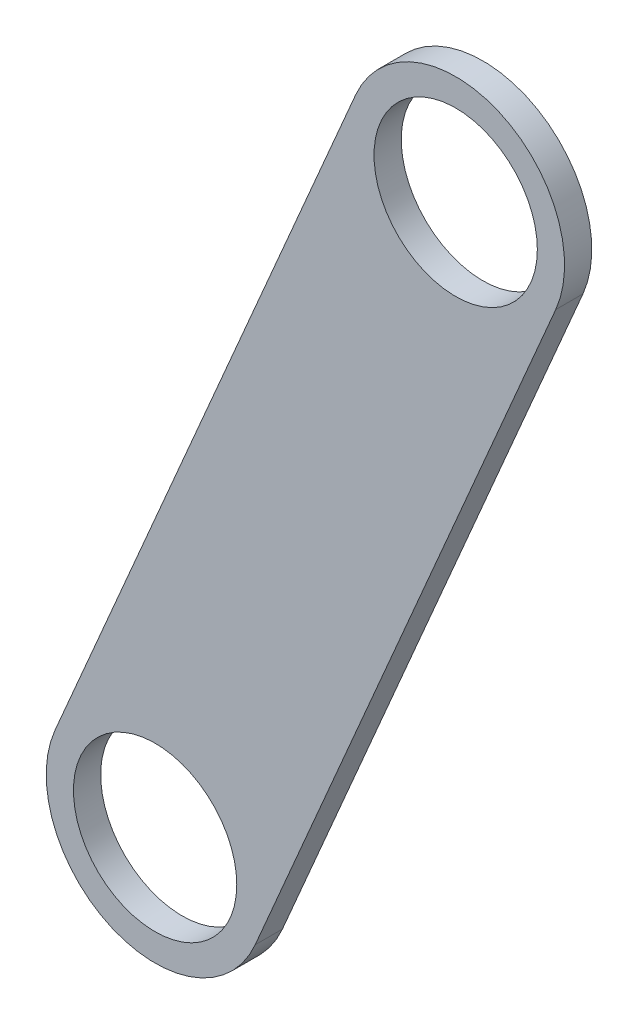
ISO-10303-21;
HEADER;
FILE_DESCRIPTION(('STEP AP214'),'2;1');
FILE_NAME('part.step','',(''),(''),'','','');
FILE_SCHEMA(('AUTOMOTIVE_DESIGN { 1 0 10303 214 1 1 1 1 }'));
ENDSEC;
DATA;
#1=APPLICATION_CONTEXT('core data for automotive mechanical design processes');
#2=APPLICATION_PROTOCOL_DEFINITION('international standard','automotive_design',2000,#1);
#3=PRODUCT_CONTEXT('',#1,'mechanical');
#4=PRODUCT('Part','Part','',(#3));
#5=PRODUCT_RELATED_PRODUCT_CATEGORY('part','',(#4));
#6=PRODUCT_DEFINITION_FORMATION('','',#4);
#7=PRODUCT_DEFINITION_CONTEXT('part definition',#1,'design');
#8=PRODUCT_DEFINITION('design','',#6,#7);
#9=PRODUCT_DEFINITION_SHAPE('','',#8);
#10=(LENGTH_UNIT() NAMED_UNIT(*) SI_UNIT(.MILLI.,.METRE.));
#11=(NAMED_UNIT(*) PLANE_ANGLE_UNIT() SI_UNIT($,.RADIAN.));
#12=(NAMED_UNIT(*) SI_UNIT($,.STERADIAN.) SOLID_ANGLE_UNIT());
#13=UNCERTAINTY_MEASURE_WITH_UNIT(LENGTH_MEASURE(1.E-05),#10,'distance_accuracy_value','');
#14=(GEOMETRIC_REPRESENTATION_CONTEXT(3) GLOBAL_UNCERTAINTY_ASSIGNED_CONTEXT((#13)) GLOBAL_UNIT_ASSIGNED_CONTEXT((#10,
#11,#12)) REPRESENTATION_CONTEXT('',''));
#15=CARTESIAN_POINT('',(0.,0.,0.));
#16=DIRECTION('',(0.,0.,1.));
#17=DIRECTION('',(1.,0.,0.));
#18=AXIS2_PLACEMENT_3D('',#15,#16,#17);
#19=CARTESIAN_POINT('',(31.7651022120724,-5.87017847864854,1.));
#20=DIRECTION('',(0.,0.,1.));
#21=DIRECTION('',(1.,0.,0.));
#22=AXIS2_PLACEMENT_3D('',#19,#20,#21);
#23=PLANE('',#22);
#24=CARTESIAN_POINT('',(31.7651022120724,-5.87017847864854,1.));
#25=DIRECTION('',(0.,0.,1.));
#26=DIRECTION('',(1.,0.,0.));
#27=AXIS2_PLACEMENT_3D('',#24,#25,#26);
#28=CIRCLE('',#27,3.);
#29=CARTESIAN_POINT('',(34.7651022120724,-5.87017847864854,1.));
#30=VERTEX_POINT('',#29);
#31=EDGE_CURVE('E108',#30,#30,#28,.T.);
#32=ORIENTED_EDGE('',*,*,#31,.F.);
#33=EDGE_LOOP('',(#32));
#34=FACE_BOUND('',#33,.T.);
#35=CARTESIAN_POINT('',(31.7651022120724,-5.87017847864854,1.));
#36=DIRECTION('',(0.,0.,1.));
#37=DIRECTION('',(1.,0.,0.));
#38=AXIS2_PLACEMENT_3D('',#35,#36,#37);
#39=CIRCLE('',#38,4.00000000000001);
#40=CARTESIAN_POINT('',(35.4409251625564,-7.44762123092038,1.));
#41=VERTEX_POINT('',#40);
#42=CARTESIAN_POINT('',(28.0892792615884,-4.2927357263767,1.));
#43=VERTEX_POINT('',#42);
#44=EDGE_CURVE('E93',#41,#43,#39,.T.);
#45=ORIENTED_EDGE('',*,*,#44,.T.);
#46=DIRECTION('',(-0.394360688067958,-0.918955737621006,0.));
#47=VECTOR('',#46,1.);
#48=CARTESIAN_POINT('',(28.0892792615884,-4.2927357263767,1.));
#49=LINE('',#48,#47);
#50=CARTESIAN_POINT('',(17.0471799956855,-30.0234963797649,1.));
#51=VERTEX_POINT('',#50);
#52=EDGE_CURVE('E88',#43,#51,#49,.T.);
#53=ORIENTED_EDGE('',*,*,#52,.T.);
#54=CARTESIAN_POINT('',(20.7230029461696,-31.6009391320367,1.));
#55=DIRECTION('',(0.,0.,1.));
#56=DIRECTION('',(1.,0.,0.));
#57=AXIS2_PLACEMENT_3D('',#54,#55,#56);
#58=CIRCLE('',#57,4.);
#59=CARTESIAN_POINT('',(24.3988258966536,-33.1783818843085,1.));
#60=VERTEX_POINT('',#59);
#61=EDGE_CURVE('E91',#51,#60,#58,.T.);
#62=ORIENTED_EDGE('',*,*,#61,.T.);
#63=DIRECTION('',(0.394360688067959,0.918955737621005,0.));
#64=VECTOR('',#63,1.);
#65=CARTESIAN_POINT('',(35.4409251625564,-7.44762123092038,1.));
#66=LINE('',#65,#64);
#67=EDGE_CURVE('E58',#60,#41,#66,.T.);
#68=ORIENTED_EDGE('',*,*,#67,.T.);
#69=EDGE_LOOP('',(#45,#53,#62,#68));
#70=FACE_BOUND('',#69,.T.);
#71=CARTESIAN_POINT('',(20.7230029461696,-31.6009391320367,1.));
#72=DIRECTION('',(0.,0.,1.));
#73=DIRECTION('',(1.,0.,0.));
#74=AXIS2_PLACEMENT_3D('',#71,#72,#73);
#75=CIRCLE('',#74,2.99999999999998);
#76=CARTESIAN_POINT('',(23.7230029461695,-31.6009391320367,1.));
#77=VERTEX_POINT('',#76);
#78=EDGE_CURVE('E123',#77,#77,#75,.T.);
#79=ORIENTED_EDGE('',*,*,#78,.F.);
#80=EDGE_LOOP('',(#79));
#81=FACE_BOUND('',#80,.T.);
#82=ADVANCED_FACE('F41',(#34,#70,#81),#23,.T.);
#83=CARTESIAN_POINT('',(31.7651022120724,-5.87017847864854,0.));
#84=DIRECTION('',(0.,0.,1.));
#85=DIRECTION('',(1.,0.,0.));
#86=AXIS2_PLACEMENT_3D('',#83,#84,#85);
#87=PLANE('',#86);
#88=CARTESIAN_POINT('',(31.7651022120724,-5.87017847864854,0.));
#89=DIRECTION('',(0.,0.,1.));
#90=DIRECTION('',(1.,0.,0.));
#91=AXIS2_PLACEMENT_3D('',#88,#89,#90);
#92=CIRCLE('',#91,4.00000000000001);
#93=CARTESIAN_POINT('',(35.4409251625564,-7.44762123092038,0.));
#94=VERTEX_POINT('',#93);
#95=CARTESIAN_POINT('',(28.0892792615884,-4.2927357263767,0.));
#96=VERTEX_POINT('',#95);
#97=EDGE_CURVE('E105',#94,#96,#92,.T.);
#98=ORIENTED_EDGE('',*,*,#97,.F.);
#99=DIRECTION('',(0.394360688067959,0.918955737621005,0.));
#100=VECTOR('',#99,1.);
#101=CARTESIAN_POINT('',(35.4409251625564,-7.44762123092038,0.));
#102=LINE('',#101,#100);
#103=CARTESIAN_POINT('',(24.3988258966536,-33.1783818843085,0.));
#104=VERTEX_POINT('',#103);
#105=EDGE_CURVE('E81',#104,#94,#102,.T.);
#106=ORIENTED_EDGE('',*,*,#105,.F.);
#107=CARTESIAN_POINT('',(20.7230029461696,-31.6009391320367,0.));
#108=DIRECTION('',(0.,0.,1.));
#109=DIRECTION('',(1.,0.,0.));
#110=AXIS2_PLACEMENT_3D('',#107,#108,#109);
#111=CIRCLE('',#110,4.);
#112=CARTESIAN_POINT('',(17.0471799956855,-30.0234963797649,0.));
#113=VERTEX_POINT('',#112);
#114=EDGE_CURVE('E75',#113,#104,#111,.T.);
#115=ORIENTED_EDGE('',*,*,#114,.F.);
#116=DIRECTION('',(-0.394360688067958,-0.918955737621006,0.));
#117=VECTOR('',#116,1.);
#118=CARTESIAN_POINT('',(28.0892792615884,-4.2927357263767,0.));
#119=LINE('',#118,#117);
#120=EDGE_CURVE('E97',#96,#113,#119,.T.);
#121=ORIENTED_EDGE('',*,*,#120,.F.);
#122=EDGE_LOOP('',(#98,#106,#115,#121));
#123=FACE_BOUND('',#122,.T.);
#124=CARTESIAN_POINT('',(31.7651022120724,-5.87017847864854,0.));
#125=DIRECTION('',(0.,0.,1.));
#126=DIRECTION('',(1.,0.,0.));
#127=AXIS2_PLACEMENT_3D('',#124,#125,#126);
#128=CIRCLE('',#127,3.);
#129=CARTESIAN_POINT('',(34.7651022120724,-5.87017847864854,0.));
#130=VERTEX_POINT('',#129);
#131=EDGE_CURVE('E120',#130,#130,#128,.T.);
#132=ORIENTED_EDGE('',*,*,#131,.T.);
#133=EDGE_LOOP('',(#132));
#134=FACE_BOUND('',#133,.T.);
#135=CARTESIAN_POINT('',(20.7230029461696,-31.6009391320367,0.));
#136=DIRECTION('',(0.,0.,1.));
#137=DIRECTION('',(1.,0.,0.));
#138=AXIS2_PLACEMENT_3D('',#135,#136,#137);
#139=CIRCLE('',#138,2.99999999999998);
#140=CARTESIAN_POINT('',(23.7230029461695,-31.6009391320367,0.));
#141=VERTEX_POINT('',#140);
#142=EDGE_CURVE('E126',#141,#141,#139,.T.);
#143=ORIENTED_EDGE('',*,*,#142,.T.);
#144=EDGE_LOOP('',(#143));
#145=FACE_BOUND('',#144,.T.);
#146=ADVANCED_FACE('F116',(#123,#134,#145),#87,.F.);
#147=CARTESIAN_POINT('',(31.7651022120724,-5.87017847864854,1.));
#148=DIRECTION('',(0.,0.,-1.));
#149=DIRECTION('',(-1.,0.,0.));
#150=AXIS2_PLACEMENT_3D('',#147,#148,#149);
#151=CYLINDRICAL_SURFACE('',#150,4.00000000000001);
#152=ORIENTED_EDGE('',*,*,#97,.T.);
#153=DIRECTION('',(0.,0.,-1.));
#154=VECTOR('',#153,1.);
#155=CARTESIAN_POINT('',(28.0892792615884,-4.2927357263767,1.));
#156=LINE('',#155,#154);
#157=EDGE_CURVE('E11',#43,#96,#156,.T.);
#158=ORIENTED_EDGE('',*,*,#157,.F.);
#159=ORIENTED_EDGE('',*,*,#44,.F.);
#160=DIRECTION('',(0.,0.,-1.));
#161=VECTOR('',#160,1.);
#162=CARTESIAN_POINT('',(35.4409251625564,-7.44762123092038,1.));
#163=LINE('',#162,#161);
#164=EDGE_CURVE('E101',#41,#94,#163,.T.);
#165=ORIENTED_EDGE('',*,*,#164,.T.);
#166=EDGE_LOOP('',(#152,#158,#159,#165));
#167=FACE_BOUND('',#166,.T.);
#168=ADVANCED_FACE('F43',(#167),#151,.T.);
#169=CARTESIAN_POINT('',(28.0892792615884,-4.2927357263767,1.));
#170=DIRECTION('',(0.918955737621006,-0.394360688067958,0.));
#171=DIRECTION('',(0.394360688067958,0.918955737621006,0.));
#172=AXIS2_PLACEMENT_3D('',#169,#170,#171);
#173=PLANE('',#172);
#174=ORIENTED_EDGE('',*,*,#120,.T.);
#175=DIRECTION('',(0.,0.,-1.));
#176=VECTOR('',#175,1.);
#177=CARTESIAN_POINT('',(17.0471799956855,-30.0234963797649,1.));
#178=LINE('',#177,#176);
#179=EDGE_CURVE('E50',#51,#113,#178,.T.);
#180=ORIENTED_EDGE('',*,*,#179,.F.);
#181=ORIENTED_EDGE('',*,*,#52,.F.);
#182=ORIENTED_EDGE('',*,*,#157,.T.);
#183=EDGE_LOOP('',(#174,#180,#181,#182));
#184=FACE_BOUND('',#183,.T.);
#185=ADVANCED_FACE('F96',(#184),#173,.F.);
#186=CARTESIAN_POINT('',(20.7230029461696,-31.6009391320367,1.));
#187=DIRECTION('',(0.,0.,-1.));
#188=DIRECTION('',(-1.,0.,0.));
#189=AXIS2_PLACEMENT_3D('',#186,#187,#188);
#190=CYLINDRICAL_SURFACE('',#189,4.);
#191=ORIENTED_EDGE('',*,*,#114,.T.);
#192=DIRECTION('',(0.,0.,-1.));
#193=VECTOR('',#192,1.);
#194=CARTESIAN_POINT('',(24.3988258966536,-33.1783818843085,1.));
#195=LINE('',#194,#193);
#196=EDGE_CURVE('E98',#60,#104,#195,.T.);
#197=ORIENTED_EDGE('',*,*,#196,.F.);
#198=ORIENTED_EDGE('',*,*,#61,.F.);
#199=ORIENTED_EDGE('',*,*,#179,.T.);
#200=EDGE_LOOP('',(#191,#197,#198,#199));
#201=FACE_BOUND('',#200,.T.);
#202=ADVANCED_FACE('F99',(#201),#190,.T.);
#203=CARTESIAN_POINT('',(35.4409251625564,-7.44762123092038,1.));
#204=DIRECTION('',(-0.918955737621005,0.394360688067959,0.));
#205=DIRECTION('',(-0.394360688067959,-0.918955737621005,0.));
#206=AXIS2_PLACEMENT_3D('',#203,#204,#205);
#207=PLANE('',#206);
#208=ORIENTED_EDGE('',*,*,#105,.T.);
#209=ORIENTED_EDGE('',*,*,#164,.F.);
#210=ORIENTED_EDGE('',*,*,#67,.F.);
#211=ORIENTED_EDGE('',*,*,#196,.T.);
#212=EDGE_LOOP('',(#208,#209,#210,#211));
#213=FACE_BOUND('',#212,.T.);
#214=ADVANCED_FACE('F113',(#213),#207,.F.);
#215=CARTESIAN_POINT('',(31.7651022120724,-5.87017847864854,1.));
#216=DIRECTION('',(0.,0.,-1.));
#217=DIRECTION('',(-1.,0.,0.));
#218=AXIS2_PLACEMENT_3D('',#215,#216,#217);
#219=CYLINDRICAL_SURFACE('',#218,3.);
#220=ORIENTED_EDGE('',*,*,#31,.T.);
#221=EDGE_LOOP('',(#220));
#222=FACE_BOUND('',#221,.T.);
#223=ORIENTED_EDGE('',*,*,#131,.F.);
#224=EDGE_LOOP('',(#223));
#225=FACE_BOUND('',#224,.T.);
#226=ADVANCED_FACE('F143',(#222,#225),#219,.F.);
#227=CARTESIAN_POINT('',(20.7230029461696,-31.6009391320367,1.));
#228=DIRECTION('',(0.,0.,-1.));
#229=DIRECTION('',(-1.,0.,0.));
#230=AXIS2_PLACEMENT_3D('',#227,#228,#229);
#231=CYLINDRICAL_SURFACE('',#230,2.99999999999998);
#232=ORIENTED_EDGE('',*,*,#78,.T.);
#233=EDGE_LOOP('',(#232));
#234=FACE_BOUND('',#233,.T.);
#235=ORIENTED_EDGE('',*,*,#142,.F.);
#236=EDGE_LOOP('',(#235));
#237=FACE_BOUND('',#236,.T.);
#238=ADVANCED_FACE('F132',(#234,#237),#231,.F.);
#239=CLOSED_SHELL('',(#82,#146,#168,#185,#202,#214,#226,#238));
#240=MANIFOLD_SOLID_BREP('B2',#239);
#241=ADVANCED_BREP_SHAPE_REPRESENTATION('',(#18,#240),#14);
#242=SHAPE_DEFINITION_REPRESENTATION(#9,#241);
ENDSEC;
END-ISO-10303-21;
